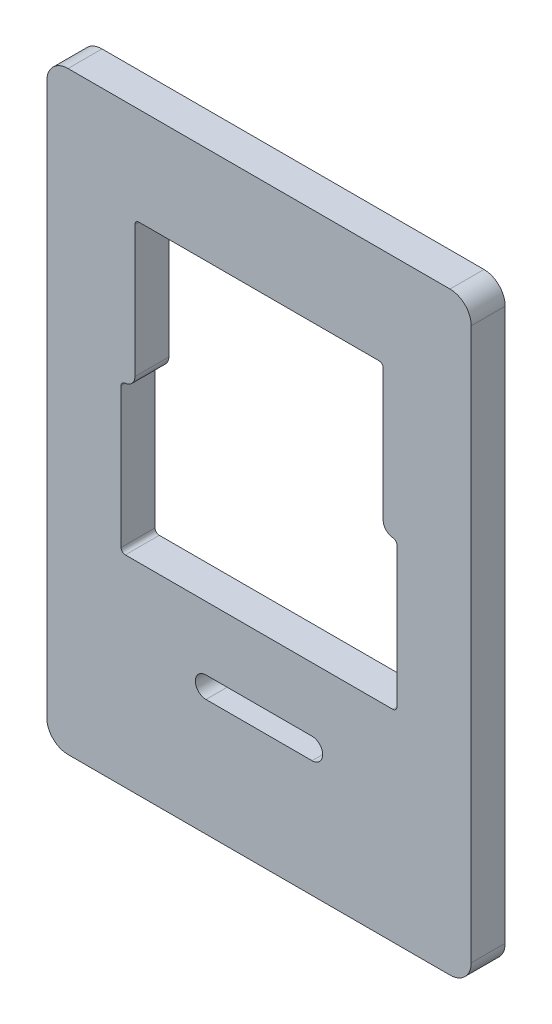
ISO-10303-21;
HEADER;
FILE_DESCRIPTION(('STEP AP214'),'2;1');
FILE_NAME('part.step','',(''),(''),'','','');
FILE_SCHEMA(('AUTOMOTIVE_DESIGN { 1 0 10303 214 1 1 1 1 }'));
ENDSEC;
DATA;
#1=APPLICATION_CONTEXT('core data for automotive mechanical design processes');
#2=APPLICATION_PROTOCOL_DEFINITION('international standard','automotive_design',2000,#1);
#3=PRODUCT_CONTEXT('',#1,'mechanical');
#4=PRODUCT('Part','Part','',(#3));
#5=PRODUCT_RELATED_PRODUCT_CATEGORY('part','',(#4));
#6=PRODUCT_DEFINITION_FORMATION('','',#4);
#7=PRODUCT_DEFINITION_CONTEXT('part definition',#1,'design');
#8=PRODUCT_DEFINITION('design','',#6,#7);
#9=PRODUCT_DEFINITION_SHAPE('','',#8);
#10=(LENGTH_UNIT() NAMED_UNIT(*) SI_UNIT(.MILLI.,.METRE.));
#11=(NAMED_UNIT(*) PLANE_ANGLE_UNIT() SI_UNIT($,.RADIAN.));
#12=(NAMED_UNIT(*) SI_UNIT($,.STERADIAN.) SOLID_ANGLE_UNIT());
#13=UNCERTAINTY_MEASURE_WITH_UNIT(LENGTH_MEASURE(1.E-05),#10,'distance_accuracy_value','');
#14=(GEOMETRIC_REPRESENTATION_CONTEXT(3) GLOBAL_UNCERTAINTY_ASSIGNED_CONTEXT((#13)) GLOBAL_UNIT_ASSIGNED_CONTEXT((#10,
#11,#12)) REPRESENTATION_CONTEXT('',''));
#15=CARTESIAN_POINT('',(0.,0.,0.));
#16=DIRECTION('',(0.,0.,1.));
#17=DIRECTION('',(1.,0.,0.));
#18=AXIS2_PLACEMENT_3D('',#15,#16,#17);
#19=CARTESIAN_POINT('',(10.,14.,-1.6));
#20=DIRECTION('',(1.,0.,0.));
#21=DIRECTION('',(0.,1.,0.));
#22=AXIS2_PLACEMENT_3D('',#19,#20,#21);
#23=PLANE('',#22);
#24=DIRECTION('',(0.,1.,0.));
#25=VECTOR('',#24,1.);
#26=CARTESIAN_POINT('',(10.,14.,0.));
#27=LINE('',#26,#25);
#28=CARTESIAN_POINT('',(10.,-13.,0.));
#29=VERTEX_POINT('',#28);
#30=CARTESIAN_POINT('',(10.,13.,0.));
#31=VERTEX_POINT('',#30);
#32=EDGE_CURVE('E248',#29,#31,#27,.T.);
#33=ORIENTED_EDGE('',*,*,#32,.F.);
#34=DIRECTION('',(0.,0.,1.));
#35=VECTOR('',#34,1.);
#36=CARTESIAN_POINT('',(10.,-13.,-1.6));
#37=LINE('',#36,#35);
#38=CARTESIAN_POINT('',(10.,-13.,-1.6));
#39=VERTEX_POINT('',#38);
#40=EDGE_CURVE('E373',#29,#39,#37,.F.);
#41=ORIENTED_EDGE('',*,*,#40,.T.);
#42=DIRECTION('',(0.,1.,0.));
#43=VECTOR('',#42,1.);
#44=CARTESIAN_POINT('',(10.,14.,-1.6));
#45=LINE('',#44,#43);
#46=CARTESIAN_POINT('',(10.,13.,-1.6));
#47=VERTEX_POINT('',#46);
#48=EDGE_CURVE('E252',#39,#47,#45,.T.);
#49=ORIENTED_EDGE('',*,*,#48,.T.);
#50=DIRECTION('',(0.,0.,1.));
#51=VECTOR('',#50,1.);
#52=CARTESIAN_POINT('',(10.,13.,-1.6));
#53=LINE('',#52,#51);
#54=EDGE_CURVE('E370',#47,#31,#53,.T.);
#55=ORIENTED_EDGE('',*,*,#54,.T.);
#56=EDGE_LOOP('',(#33,#41,#49,#55));
#57=FACE_BOUND('',#56,.T.);
#58=ADVANCED_FACE('F32',(#57),#23,.T.);
#59=CARTESIAN_POINT('',(-10.,-14.,-1.6));
#60=DIRECTION('',(0.,-1.,0.));
#61=DIRECTION('',(0.,0.,-1.));
#62=AXIS2_PLACEMENT_3D('',#59,#60,#61);
#63=PLANE('',#62);
#64=DIRECTION('',(1.,0.,0.));
#65=VECTOR('',#64,1.);
#66=CARTESIAN_POINT('',(-10.,-14.,0.));
#67=LINE('',#66,#65);
#68=CARTESIAN_POINT('',(-9.,-14.,0.));
#69=VERTEX_POINT('',#68);
#70=CARTESIAN_POINT('',(9.,-14.,0.));
#71=VERTEX_POINT('',#70);
#72=EDGE_CURVE('E256',#69,#71,#67,.T.);
#73=ORIENTED_EDGE('',*,*,#72,.F.);
#74=DIRECTION('',(0.,0.,1.));
#75=VECTOR('',#74,1.);
#76=CARTESIAN_POINT('',(-9.,-14.,-1.6));
#77=LINE('',#76,#75);
#78=CARTESIAN_POINT('',(-9.,-14.,-1.6));
#79=VERTEX_POINT('',#78);
#80=EDGE_CURVE('E361',#69,#79,#77,.F.);
#81=ORIENTED_EDGE('',*,*,#80,.T.);
#82=DIRECTION('',(1.,0.,0.));
#83=VECTOR('',#82,1.);
#84=CARTESIAN_POINT('',(-10.,-14.,-1.6));
#85=LINE('',#84,#83);
#86=CARTESIAN_POINT('',(9.,-14.,-1.6));
#87=VERTEX_POINT('',#86);
#88=EDGE_CURVE('E261',#79,#87,#85,.T.);
#89=ORIENTED_EDGE('',*,*,#88,.T.);
#90=DIRECTION('',(0.,0.,1.));
#91=VECTOR('',#90,1.);
#92=CARTESIAN_POINT('',(9.,-14.,-1.6));
#93=LINE('',#92,#91);
#94=EDGE_CURVE('E358',#87,#71,#93,.T.);
#95=ORIENTED_EDGE('',*,*,#94,.T.);
#96=EDGE_LOOP('',(#73,#81,#89,#95));
#97=FACE_BOUND('',#96,.T.);
#98=ADVANCED_FACE('F396',(#97),#63,.T.);
#99=CARTESIAN_POINT('',(-10.,14.,-1.6));
#100=DIRECTION('',(-1.,0.,0.));
#101=DIRECTION('',(0.,-1.,0.));
#102=AXIS2_PLACEMENT_3D('',#99,#100,#101);
#103=PLANE('',#102);
#104=DIRECTION('',(0.,-1.,0.));
#105=VECTOR('',#104,1.);
#106=CARTESIAN_POINT('',(-10.,14.,-1.6));
#107=LINE('',#106,#105);
#108=CARTESIAN_POINT('',(-10.,13.,-1.6));
#109=VERTEX_POINT('',#108);
#110=CARTESIAN_POINT('',(-10.,-13.,-1.6));
#111=VERTEX_POINT('',#110);
#112=EDGE_CURVE('E258',#109,#111,#107,.T.);
#113=ORIENTED_EDGE('',*,*,#112,.T.);
#114=DIRECTION('',(0.,0.,1.));
#115=VECTOR('',#114,1.);
#116=CARTESIAN_POINT('',(-10.,-13.,-1.6));
#117=LINE('',#116,#115);
#118=CARTESIAN_POINT('',(-10.,-13.,0.));
#119=VERTEX_POINT('',#118);
#120=EDGE_CURVE('E347',#111,#119,#117,.T.);
#121=ORIENTED_EDGE('',*,*,#120,.T.);
#122=DIRECTION('',(0.,-1.,0.));
#123=VECTOR('',#122,1.);
#124=CARTESIAN_POINT('',(-10.,14.,0.));
#125=LINE('',#124,#123);
#126=CARTESIAN_POINT('',(-10.,13.,0.));
#127=VERTEX_POINT('',#126);
#128=EDGE_CURVE('E270',#127,#119,#125,.T.);
#129=ORIENTED_EDGE('',*,*,#128,.F.);
#130=DIRECTION('',(0.,0.,1.));
#131=VECTOR('',#130,1.);
#132=CARTESIAN_POINT('',(-10.,13.,-1.6));
#133=LINE('',#132,#131);
#134=EDGE_CURVE('E345',#127,#109,#133,.F.);
#135=ORIENTED_EDGE('',*,*,#134,.T.);
#136=EDGE_LOOP('',(#113,#121,#129,#135));
#137=FACE_BOUND('',#136,.T.);
#138=ADVANCED_FACE('F403',(#137),#103,.T.);
#139=CARTESIAN_POINT('',(-10.,14.,-1.6));
#140=DIRECTION('',(0.,1.,0.));
#141=DIRECTION('',(0.,0.,1.));
#142=AXIS2_PLACEMENT_3D('',#139,#140,#141);
#143=PLANE('',#142);
#144=DIRECTION('',(-1.,0.,0.));
#145=VECTOR('',#144,1.);
#146=CARTESIAN_POINT('',(-10.,14.,0.));
#147=LINE('',#146,#145);
#148=CARTESIAN_POINT('',(9.,14.,0.));
#149=VERTEX_POINT('',#148);
#150=CARTESIAN_POINT('',(-9.,14.,0.));
#151=VERTEX_POINT('',#150);
#152=EDGE_CURVE('E267',#149,#151,#147,.T.);
#153=ORIENTED_EDGE('',*,*,#152,.F.);
#154=DIRECTION('',(0.,0.,1.));
#155=VECTOR('',#154,1.);
#156=CARTESIAN_POINT('',(9.,14.,-1.6));
#157=LINE('',#156,#155);
#158=CARTESIAN_POINT('',(9.,14.,-1.6));
#159=VERTEX_POINT('',#158);
#160=EDGE_CURVE('E11',#149,#159,#157,.F.);
#161=ORIENTED_EDGE('',*,*,#160,.T.);
#162=DIRECTION('',(-1.,0.,0.));
#163=VECTOR('',#162,1.);
#164=CARTESIAN_POINT('',(-10.,14.,-1.6));
#165=LINE('',#164,#163);
#166=CARTESIAN_POINT('',(-9.,14.,-1.6));
#167=VERTEX_POINT('',#166);
#168=EDGE_CURVE('E255',#159,#167,#165,.T.);
#169=ORIENTED_EDGE('',*,*,#168,.T.);
#170=DIRECTION('',(0.,0.,1.));
#171=VECTOR('',#170,1.);
#172=CARTESIAN_POINT('',(-9.,14.,-1.6));
#173=LINE('',#172,#171);
#174=EDGE_CURVE('E40',#167,#151,#173,.T.);
#175=ORIENTED_EDGE('',*,*,#174,.T.);
#176=EDGE_LOOP('',(#153,#161,#169,#175));
#177=FACE_BOUND('',#176,.T.);
#178=ADVANCED_FACE('F376',(#177),#143,.T.);
#179=CARTESIAN_POINT('',(0.,0.,-1.6));
#180=DIRECTION('',(0.,0.,1.));
#181=DIRECTION('',(1.,0.,0.));
#182=AXIS2_PLACEMENT_3D('',#179,#180,#181);
#183=PLANE('',#182);
#184=DIRECTION('',(0.,1.,0.));
#185=VECTOR('',#184,1.);
#186=CARTESIAN_POINT('',(6.5,2.5,-1.6));
#187=LINE('',#186,#185);
#188=CARTESIAN_POINT('',(6.5,-4.3,-1.6));
#189=VERTEX_POINT('',#188);
#190=CARTESIAN_POINT('',(6.5,2.30178799781155,-1.6));
#191=VERTEX_POINT('',#190);
#192=EDGE_CURVE('E663',#189,#191,#187,.T.);
#193=ORIENTED_EDGE('',*,*,#192,.T.);
#194=CARTESIAN_POINT('',(6.3,2.30178799781155,-1.6));
#195=DIRECTION('',(0.,0.,1.));
#196=DIRECTION('',(1.,0.,0.));
#197=AXIS2_PLACEMENT_3D('',#194,#195,#196);
#198=CIRCLE('',#197,0.2);
#199=CARTESIAN_POINT('',(6.31428571428571,2.50127714129396,-1.6));
#200=VERTEX_POINT('',#199);
#201=EDGE_CURVE('E331',#191,#200,#198,.T.);
#202=ORIENTED_EDGE('',*,*,#201,.T.);
#203=CARTESIAN_POINT('',(6.35,3.,-1.6));
#204=DIRECTION('',(0.,0.,1.));
#205=DIRECTION('',(1.,0.,0.));
#206=AXIS2_PLACEMENT_3D('',#203,#204,#205);
#207=CIRCLE('',#206,0.5);
#208=CARTESIAN_POINT('',(5.85,3.,-1.6));
#209=VERTEX_POINT('',#208);
#210=EDGE_CURVE('E286',#200,#209,#207,.F.);
#211=ORIENTED_EDGE('',*,*,#210,.T.);
#212=DIRECTION('',(0.,1.,0.));
#213=VECTOR('',#212,1.);
#214=CARTESIAN_POINT('',(5.85,9.4,-1.6));
#215=LINE('',#214,#213);
#216=CARTESIAN_POINT('',(5.85,9.2,-1.6));
#217=VERTEX_POINT('',#216);
#218=EDGE_CURVE('E691',#209,#217,#215,.T.);
#219=ORIENTED_EDGE('',*,*,#218,.T.);
#220=CARTESIAN_POINT('',(5.65,9.2,-1.6));
#221=DIRECTION('',(0.,0.,1.));
#222=DIRECTION('',(1.,0.,0.));
#223=AXIS2_PLACEMENT_3D('',#220,#221,#222);
#224=CIRCLE('',#223,0.2);
#225=CARTESIAN_POINT('',(5.65,9.4,-1.6));
#226=VERTEX_POINT('',#225);
#227=EDGE_CURVE('E343',#217,#226,#224,.T.);
#228=ORIENTED_EDGE('',*,*,#227,.T.);
#229=DIRECTION('',(-1.,0.,0.));
#230=VECTOR('',#229,1.);
#231=CARTESIAN_POINT('',(-5.85,9.4,-1.6));
#232=LINE('',#231,#230);
#233=CARTESIAN_POINT('',(-5.65,9.4,-1.6));
#234=VERTEX_POINT('',#233);
#235=EDGE_CURVE('E722',#226,#234,#232,.T.);
#236=ORIENTED_EDGE('',*,*,#235,.T.);
#237=CARTESIAN_POINT('',(-5.65,9.2,-1.6));
#238=DIRECTION('',(0.,0.,1.));
#239=DIRECTION('',(1.,0.,0.));
#240=AXIS2_PLACEMENT_3D('',#237,#238,#239);
#241=CIRCLE('',#240,0.2);
#242=CARTESIAN_POINT('',(-5.85,9.2,-1.6));
#243=VERTEX_POINT('',#242);
#244=EDGE_CURVE('E339',#234,#243,#241,.T.);
#245=ORIENTED_EDGE('',*,*,#244,.T.);
#246=DIRECTION('',(0.,-1.,0.));
#247=VECTOR('',#246,1.);
#248=CARTESIAN_POINT('',(-5.85,9.4,-1.6));
#249=LINE('',#248,#247);
#250=CARTESIAN_POINT('',(-5.85,3.,-1.6));
#251=VERTEX_POINT('',#250);
#252=EDGE_CURVE('E688',#243,#251,#249,.T.);
#253=ORIENTED_EDGE('',*,*,#252,.T.);
#254=CARTESIAN_POINT('',(-6.35,3.,-1.6));
#255=DIRECTION('',(0.,0.,1.));
#256=DIRECTION('',(1.,0.,0.));
#257=AXIS2_PLACEMENT_3D('',#254,#255,#256);
#258=CIRCLE('',#257,0.5);
#259=CARTESIAN_POINT('',(-6.31428571428571,2.50127714129396,-1.6));
#260=VERTEX_POINT('',#259);
#261=EDGE_CURVE('E283',#251,#260,#258,.F.);
#262=ORIENTED_EDGE('',*,*,#261,.T.);
#263=CARTESIAN_POINT('',(-6.3,2.30178799781155,-1.6));
#264=DIRECTION('',(0.,0.,1.));
#265=DIRECTION('',(1.,0.,0.));
#266=AXIS2_PLACEMENT_3D('',#263,#264,#265);
#267=CIRCLE('',#266,0.2);
#268=CARTESIAN_POINT('',(-6.5,2.30178799781155,-1.6));
#269=VERTEX_POINT('',#268);
#270=EDGE_CURVE('E335',#260,#269,#267,.T.);
#271=ORIENTED_EDGE('',*,*,#270,.T.);
#272=DIRECTION('',(0.,-1.,0.));
#273=VECTOR('',#272,1.);
#274=CARTESIAN_POINT('',(-6.5,2.5,-1.6));
#275=LINE('',#274,#273);
#276=CARTESIAN_POINT('',(-6.5,-4.3,-1.6));
#277=VERTEX_POINT('',#276);
#278=EDGE_CURVE('E669',#269,#277,#275,.T.);
#279=ORIENTED_EDGE('',*,*,#278,.T.);
#280=CARTESIAN_POINT('',(-6.3,-4.3,-1.6));
#281=DIRECTION('',(0.,0.,1.));
#282=DIRECTION('',(1.,0.,0.));
#283=AXIS2_PLACEMENT_3D('',#280,#281,#282);
#284=CIRCLE('',#283,0.2);
#285=CARTESIAN_POINT('',(-6.3,-4.5,-1.6));
#286=VERTEX_POINT('',#285);
#287=EDGE_CURVE('E323',#277,#286,#284,.T.);
#288=ORIENTED_EDGE('',*,*,#287,.T.);
#289=DIRECTION('',(1.,0.,0.));
#290=VECTOR('',#289,1.);
#291=CARTESIAN_POINT('',(-6.5,-4.5,-1.6));
#292=LINE('',#291,#290);
#293=CARTESIAN_POINT('',(6.3,-4.5,-1.6));
#294=VERTEX_POINT('',#293);
#295=EDGE_CURVE('E242',#286,#294,#292,.T.);
#296=ORIENTED_EDGE('',*,*,#295,.T.);
#297=CARTESIAN_POINT('',(6.3,-4.3,-1.6));
#298=DIRECTION('',(0.,0.,1.));
#299=DIRECTION('',(1.,0.,0.));
#300=AXIS2_PLACEMENT_3D('',#297,#298,#299);
#301=CIRCLE('',#300,0.2);
#302=EDGE_CURVE('E327',#294,#189,#301,.T.);
#303=ORIENTED_EDGE('',*,*,#302,.T.);
#304=EDGE_LOOP('',(#193,#202,#211,#219,#228,#236,#245,#253,#262,#271,#279,#288,#296,#303));
#305=FACE_BOUND('',#304,.T.);
#306=DIRECTION('',(-1.,0.,0.));
#307=VECTOR('',#306,1.);
#308=CARTESIAN_POINT('',(-2.5,-7.5,-1.6));
#309=LINE('',#308,#307);
#310=CARTESIAN_POINT('',(2.5,-7.5,-1.6));
#311=VERTEX_POINT('',#310);
#312=CARTESIAN_POINT('',(-2.5,-7.5,-1.6));
#313=VERTEX_POINT('',#312);
#314=EDGE_CURVE('E217',#311,#313,#309,.T.);
#315=ORIENTED_EDGE('',*,*,#314,.T.);
#316=CARTESIAN_POINT('',(-2.5,-8.,-1.6));
#317=DIRECTION('',(0.,0.,1.));
#318=DIRECTION('',(1.,0.,0.));
#319=AXIS2_PLACEMENT_3D('',#316,#317,#318);
#320=CIRCLE('',#319,0.5);
#321=CARTESIAN_POINT('',(-2.5,-8.5,-1.6));
#322=VERTEX_POINT('',#321);
#323=EDGE_CURVE('E209',#313,#322,#320,.T.);
#324=ORIENTED_EDGE('',*,*,#323,.T.);
#325=DIRECTION('',(1.,0.,0.));
#326=VECTOR('',#325,1.);
#327=CARTESIAN_POINT('',(-2.5,-8.5,-1.6));
#328=LINE('',#327,#326);
#329=CARTESIAN_POINT('',(2.5,-8.5,-1.6));
#330=VERTEX_POINT('',#329);
#331=EDGE_CURVE('E221',#322,#330,#328,.T.);
#332=ORIENTED_EDGE('',*,*,#331,.T.);
#333=CARTESIAN_POINT('',(2.5,-8.,-1.6));
#334=DIRECTION('',(0.,0.,1.));
#335=DIRECTION('',(1.,0.,0.));
#336=AXIS2_PLACEMENT_3D('',#333,#334,#335);
#337=CIRCLE('',#336,0.5);
#338=EDGE_CURVE('E225',#330,#311,#337,.T.);
#339=ORIENTED_EDGE('',*,*,#338,.T.);
#340=EDGE_LOOP('',(#315,#324,#332,#339));
#341=FACE_BOUND('',#340,.T.);
#342=ORIENTED_EDGE('',*,*,#88,.F.);
#343=CARTESIAN_POINT('',(-9.,-13.,-1.6));
#344=DIRECTION('',(0.,0.,1.));
#345=DIRECTION('',(1.,0.,0.));
#346=AXIS2_PLACEMENT_3D('',#343,#344,#345);
#347=CIRCLE('',#346,1.);
#348=EDGE_CURVE('E368',#79,#111,#347,.F.);
#349=ORIENTED_EDGE('',*,*,#348,.T.);
#350=ORIENTED_EDGE('',*,*,#112,.F.);
#351=CARTESIAN_POINT('',(-9.,13.,-1.6));
#352=DIRECTION('',(0.,0.,1.));
#353=DIRECTION('',(1.,0.,0.));
#354=AXIS2_PLACEMENT_3D('',#351,#352,#353);
#355=CIRCLE('',#354,1.);
#356=EDGE_CURVE('E47',#109,#167,#355,.F.);
#357=ORIENTED_EDGE('',*,*,#356,.T.);
#358=ORIENTED_EDGE('',*,*,#168,.F.);
#359=CARTESIAN_POINT('',(9.,13.,-1.6));
#360=DIRECTION('',(0.,0.,1.));
#361=DIRECTION('',(1.,0.,0.));
#362=AXIS2_PLACEMENT_3D('',#359,#360,#361);
#363=CIRCLE('',#362,1.);
#364=EDGE_CURVE('E364',#159,#47,#363,.F.);
#365=ORIENTED_EDGE('',*,*,#364,.T.);
#366=ORIENTED_EDGE('',*,*,#48,.F.);
#367=CARTESIAN_POINT('',(9.,-13.,-1.6));
#368=DIRECTION('',(0.,0.,1.));
#369=DIRECTION('',(1.,0.,0.));
#370=AXIS2_PLACEMENT_3D('',#367,#368,#369);
#371=CIRCLE('',#370,1.);
#372=EDGE_CURVE('E366',#39,#87,#371,.F.);
#373=ORIENTED_EDGE('',*,*,#372,.T.);
#374=EDGE_LOOP('',(#342,#349,#350,#357,#358,#365,#366,#373));
#375=FACE_BOUND('',#374,.T.);
#376=ADVANCED_FACE('F227',(#305,#341,#375),#183,.F.);
#377=CARTESIAN_POINT('',(0.,0.,0.));
#378=DIRECTION('',(0.,0.,1.));
#379=DIRECTION('',(1.,0.,0.));
#380=AXIS2_PLACEMENT_3D('',#377,#378,#379);
#381=PLANE('',#380);
#382=DIRECTION('',(0.,1.,0.));
#383=VECTOR('',#382,1.);
#384=CARTESIAN_POINT('',(5.85,9.4,0.));
#385=LINE('',#384,#383);
#386=CARTESIAN_POINT('',(5.85,3.,0.));
#387=VERTEX_POINT('',#386);
#388=CARTESIAN_POINT('',(5.85,9.2,0.));
#389=VERTEX_POINT('',#388);
#390=EDGE_CURVE('E679',#387,#389,#385,.T.);
#391=ORIENTED_EDGE('',*,*,#390,.F.);
#392=CARTESIAN_POINT('',(6.35,3.,0.));
#393=DIRECTION('',(0.,0.,1.));
#394=DIRECTION('',(1.,0.,0.));
#395=AXIS2_PLACEMENT_3D('',#392,#393,#394);
#396=CIRCLE('',#395,0.5);
#397=CARTESIAN_POINT('',(6.31428571428571,2.50127714129396,0.));
#398=VERTEX_POINT('',#397);
#399=EDGE_CURVE('E280',#387,#398,#396,.T.);
#400=ORIENTED_EDGE('',*,*,#399,.T.);
#401=CARTESIAN_POINT('',(6.3,2.30178799781155,0.));
#402=DIRECTION('',(0.,0.,1.));
#403=DIRECTION('',(1.,0.,0.));
#404=AXIS2_PLACEMENT_3D('',#401,#402,#403);
#405=CIRCLE('',#404,0.2);
#406=CARTESIAN_POINT('',(6.5,2.30178799781155,0.));
#407=VERTEX_POINT('',#406);
#408=EDGE_CURVE('E329',#398,#407,#405,.F.);
#409=ORIENTED_EDGE('',*,*,#408,.T.);
#410=DIRECTION('',(0.,1.,0.));
#411=VECTOR('',#410,1.);
#412=CARTESIAN_POINT('',(6.5,2.5,0.));
#413=LINE('',#412,#411);
#414=CARTESIAN_POINT('',(6.5,-4.3,0.));
#415=VERTEX_POINT('',#414);
#416=EDGE_CURVE('E696',#415,#407,#413,.T.);
#417=ORIENTED_EDGE('',*,*,#416,.F.);
#418=CARTESIAN_POINT('',(6.3,-4.3,0.));
#419=DIRECTION('',(0.,0.,1.));
#420=DIRECTION('',(1.,0.,0.));
#421=AXIS2_PLACEMENT_3D('',#418,#419,#420);
#422=CIRCLE('',#421,0.2);
#423=CARTESIAN_POINT('',(6.3,-4.5,0.));
#424=VERTEX_POINT('',#423);
#425=EDGE_CURVE('E325',#415,#424,#422,.F.);
#426=ORIENTED_EDGE('',*,*,#425,.T.);
#427=DIRECTION('',(1.,0.,0.));
#428=VECTOR('',#427,1.);
#429=CARTESIAN_POINT('',(-6.5,-4.5,0.));
#430=LINE('',#429,#428);
#431=CARTESIAN_POINT('',(-6.3,-4.5,0.));
#432=VERTEX_POINT('',#431);
#433=EDGE_CURVE('E235',#432,#424,#430,.T.);
#434=ORIENTED_EDGE('',*,*,#433,.F.);
#435=CARTESIAN_POINT('',(-6.3,-4.3,0.));
#436=DIRECTION('',(0.,0.,1.));
#437=DIRECTION('',(1.,0.,0.));
#438=AXIS2_PLACEMENT_3D('',#435,#436,#437);
#439=CIRCLE('',#438,0.2);
#440=CARTESIAN_POINT('',(-6.5,-4.3,0.));
#441=VERTEX_POINT('',#440);
#442=EDGE_CURVE('E321',#432,#441,#439,.F.);
#443=ORIENTED_EDGE('',*,*,#442,.T.);
#444=DIRECTION('',(0.,-1.,0.));
#445=VECTOR('',#444,1.);
#446=CARTESIAN_POINT('',(-6.5,2.5,0.));
#447=LINE('',#446,#445);
#448=CARTESIAN_POINT('',(-6.5,2.30178799781155,0.));
#449=VERTEX_POINT('',#448);
#450=EDGE_CURVE('E697',#449,#441,#447,.T.);
#451=ORIENTED_EDGE('',*,*,#450,.F.);
#452=CARTESIAN_POINT('',(-6.3,2.30178799781155,0.));
#453=DIRECTION('',(0.,0.,1.));
#454=DIRECTION('',(1.,0.,0.));
#455=AXIS2_PLACEMENT_3D('',#452,#453,#454);
#456=CIRCLE('',#455,0.2);
#457=CARTESIAN_POINT('',(-6.31428571428571,2.50127714129396,0.));
#458=VERTEX_POINT('',#457);
#459=EDGE_CURVE('E333',#449,#458,#456,.F.);
#460=ORIENTED_EDGE('',*,*,#459,.T.);
#461=CARTESIAN_POINT('',(-6.35,3.,0.));
#462=DIRECTION('',(0.,0.,1.));
#463=DIRECTION('',(1.,0.,0.));
#464=AXIS2_PLACEMENT_3D('',#461,#462,#463);
#465=CIRCLE('',#464,0.5);
#466=CARTESIAN_POINT('',(-5.85,3.,0.));
#467=VERTEX_POINT('',#466);
#468=EDGE_CURVE('E277',#458,#467,#465,.T.);
#469=ORIENTED_EDGE('',*,*,#468,.T.);
#470=DIRECTION('',(0.,-1.,0.));
#471=VECTOR('',#470,1.);
#472=CARTESIAN_POINT('',(-5.85,9.4,0.));
#473=LINE('',#472,#471);
#474=CARTESIAN_POINT('',(-5.85,9.2,0.));
#475=VERTEX_POINT('',#474);
#476=EDGE_CURVE('E685',#475,#467,#473,.T.);
#477=ORIENTED_EDGE('',*,*,#476,.F.);
#478=CARTESIAN_POINT('',(-5.65,9.2,0.));
#479=DIRECTION('',(0.,0.,1.));
#480=DIRECTION('',(1.,0.,0.));
#481=AXIS2_PLACEMENT_3D('',#478,#479,#480);
#482=CIRCLE('',#481,0.2);
#483=CARTESIAN_POINT('',(-5.65,9.4,0.));
#484=VERTEX_POINT('',#483);
#485=EDGE_CURVE('E337',#475,#484,#482,.F.);
#486=ORIENTED_EDGE('',*,*,#485,.T.);
#487=DIRECTION('',(-1.,0.,0.));
#488=VECTOR('',#487,1.);
#489=CARTESIAN_POINT('',(-5.85,9.4,0.));
#490=LINE('',#489,#488);
#491=CARTESIAN_POINT('',(5.65,9.4,0.));
#492=VERTEX_POINT('',#491);
#493=EDGE_CURVE('E682',#492,#484,#490,.T.);
#494=ORIENTED_EDGE('',*,*,#493,.F.);
#495=CARTESIAN_POINT('',(5.65,9.2,0.));
#496=DIRECTION('',(0.,0.,1.));
#497=DIRECTION('',(1.,0.,0.));
#498=AXIS2_PLACEMENT_3D('',#495,#496,#497);
#499=CIRCLE('',#498,0.2);
#500=EDGE_CURVE('E341',#492,#389,#499,.F.);
#501=ORIENTED_EDGE('',*,*,#500,.T.);
#502=EDGE_LOOP('',(#391,#400,#409,#417,#426,#434,#443,#451,#460,#469,#477,#486,#494,#501));
#503=FACE_BOUND('',#502,.T.);
#504=CARTESIAN_POINT('',(-2.5,-8.,0.));
#505=DIRECTION('',(0.,0.,1.));
#506=DIRECTION('',(1.,0.,0.));
#507=AXIS2_PLACEMENT_3D('',#504,#505,#506);
#508=CIRCLE('',#507,0.5);
#509=CARTESIAN_POINT('',(-2.5,-7.5,0.));
#510=VERTEX_POINT('',#509);
#511=CARTESIAN_POINT('',(-2.5,-8.5,0.));
#512=VERTEX_POINT('',#511);
#513=EDGE_CURVE('E212',#510,#512,#508,.T.);
#514=ORIENTED_EDGE('',*,*,#513,.F.);
#515=DIRECTION('',(-1.,0.,0.));
#516=VECTOR('',#515,1.);
#517=CARTESIAN_POINT('',(-2.5,-7.5,0.));
#518=LINE('',#517,#516);
#519=CARTESIAN_POINT('',(2.5,-7.5,0.));
#520=VERTEX_POINT('',#519);
#521=EDGE_CURVE('E229',#520,#510,#518,.T.);
#522=ORIENTED_EDGE('',*,*,#521,.F.);
#523=CARTESIAN_POINT('',(2.5,-8.,0.));
#524=DIRECTION('',(0.,0.,1.));
#525=DIRECTION('',(1.,0.,0.));
#526=AXIS2_PLACEMENT_3D('',#523,#524,#525);
#527=CIRCLE('',#526,0.5);
#528=CARTESIAN_POINT('',(2.5,-8.5,0.));
#529=VERTEX_POINT('',#528);
#530=EDGE_CURVE('E232',#529,#520,#527,.T.);
#531=ORIENTED_EDGE('',*,*,#530,.F.);
#532=DIRECTION('',(1.,0.,0.));
#533=VECTOR('',#532,1.);
#534=CARTESIAN_POINT('',(-2.5,-8.5,0.));
#535=LINE('',#534,#533);
#536=EDGE_CURVE('E241',#512,#529,#535,.T.);
#537=ORIENTED_EDGE('',*,*,#536,.F.);
#538=EDGE_LOOP('',(#514,#522,#531,#537));
#539=FACE_BOUND('',#538,.T.);
#540=ORIENTED_EDGE('',*,*,#128,.T.);
#541=CARTESIAN_POINT('',(-9.,-13.,0.));
#542=DIRECTION('',(0.,0.,1.));
#543=DIRECTION('',(1.,0.,0.));
#544=AXIS2_PLACEMENT_3D('',#541,#542,#543);
#545=CIRCLE('',#544,1.);
#546=EDGE_CURVE('E356',#119,#69,#545,.T.);
#547=ORIENTED_EDGE('',*,*,#546,.T.);
#548=ORIENTED_EDGE('',*,*,#72,.T.);
#549=CARTESIAN_POINT('',(9.,-13.,0.));
#550=DIRECTION('',(0.,0.,1.));
#551=DIRECTION('',(1.,0.,0.));
#552=AXIS2_PLACEMENT_3D('',#549,#550,#551);
#553=CIRCLE('',#552,1.);
#554=EDGE_CURVE('E354',#71,#29,#553,.T.);
#555=ORIENTED_EDGE('',*,*,#554,.T.);
#556=ORIENTED_EDGE('',*,*,#32,.T.);
#557=CARTESIAN_POINT('',(9.,13.,0.));
#558=DIRECTION('',(0.,0.,1.));
#559=DIRECTION('',(1.,0.,0.));
#560=AXIS2_PLACEMENT_3D('',#557,#558,#559);
#561=CIRCLE('',#560,1.);
#562=EDGE_CURVE('E352',#31,#149,#561,.T.);
#563=ORIENTED_EDGE('',*,*,#562,.T.);
#564=ORIENTED_EDGE('',*,*,#152,.T.);
#565=CARTESIAN_POINT('',(-9.,13.,0.));
#566=DIRECTION('',(0.,0.,1.));
#567=DIRECTION('',(1.,0.,0.));
#568=AXIS2_PLACEMENT_3D('',#565,#566,#567);
#569=CIRCLE('',#568,1.);
#570=EDGE_CURVE('E350',#151,#127,#569,.T.);
#571=ORIENTED_EDGE('',*,*,#570,.T.);
#572=EDGE_LOOP('',(#540,#547,#548,#555,#556,#563,#564,#571));
#573=FACE_BOUND('',#572,.T.);
#574=ADVANCED_FACE('F379',(#503,#539,#573),#381,.T.);
#575=CARTESIAN_POINT('',(-2.5,-8.,-1.6));
#576=DIRECTION('',(0.,0.,1.));
#577=DIRECTION('',(1.,0.,0.));
#578=AXIS2_PLACEMENT_3D('',#575,#576,#577);
#579=CYLINDRICAL_SURFACE('',#578,0.5);
#580=ORIENTED_EDGE('',*,*,#513,.T.);
#581=DIRECTION('',(0.,0.,1.));
#582=VECTOR('',#581,1.);
#583=CARTESIAN_POINT('',(-2.5,-8.5,-1.6));
#584=LINE('',#583,#582);
#585=EDGE_CURVE('E205',#322,#512,#584,.T.);
#586=ORIENTED_EDGE('',*,*,#585,.F.);
#587=ORIENTED_EDGE('',*,*,#323,.F.);
#588=DIRECTION('',(0.,0.,1.));
#589=VECTOR('',#588,1.);
#590=CARTESIAN_POINT('',(-2.5,-7.5,-1.6));
#591=LINE('',#590,#589);
#592=EDGE_CURVE('E246',#313,#510,#591,.T.);
#593=ORIENTED_EDGE('',*,*,#592,.T.);
#594=EDGE_LOOP('',(#580,#586,#587,#593));
#595=FACE_BOUND('',#594,.T.);
#596=ADVANCED_FACE('F207',(#595),#579,.F.);
#597=CARTESIAN_POINT('',(-2.5,-7.5,-1.6));
#598=DIRECTION('',(0.,1.,0.));
#599=DIRECTION('',(-1.,0.,0.));
#600=AXIS2_PLACEMENT_3D('',#597,#598,#599);
#601=PLANE('',#600);
#602=ORIENTED_EDGE('',*,*,#521,.T.);
#603=ORIENTED_EDGE('',*,*,#592,.F.);
#604=ORIENTED_EDGE('',*,*,#314,.F.);
#605=DIRECTION('',(0.,0.,1.));
#606=VECTOR('',#605,1.);
#607=CARTESIAN_POINT('',(2.5,-7.5,-1.6));
#608=LINE('',#607,#606);
#609=EDGE_CURVE('E249',#311,#520,#608,.T.);
#610=ORIENTED_EDGE('',*,*,#609,.T.);
#611=EDGE_LOOP('',(#602,#603,#604,#610));
#612=FACE_BOUND('',#611,.T.);
#613=ADVANCED_FACE('F584',(#612),#601,.F.);
#614=CARTESIAN_POINT('',(2.5,-8.,-1.6));
#615=DIRECTION('',(0.,0.,1.));
#616=DIRECTION('',(1.,0.,0.));
#617=AXIS2_PLACEMENT_3D('',#614,#615,#616);
#618=CYLINDRICAL_SURFACE('',#617,0.5);
#619=ORIENTED_EDGE('',*,*,#530,.T.);
#620=ORIENTED_EDGE('',*,*,#609,.F.);
#621=ORIENTED_EDGE('',*,*,#338,.F.);
#622=DIRECTION('',(0.,0.,1.));
#623=VECTOR('',#622,1.);
#624=CARTESIAN_POINT('',(2.5,-8.5,-1.6));
#625=LINE('',#624,#623);
#626=EDGE_CURVE('E216',#330,#529,#625,.T.);
#627=ORIENTED_EDGE('',*,*,#626,.T.);
#628=EDGE_LOOP('',(#619,#620,#621,#627));
#629=FACE_BOUND('',#628,.T.);
#630=ADVANCED_FACE('F576',(#629),#618,.F.);
#631=CARTESIAN_POINT('',(-2.5,-8.5,-1.6));
#632=DIRECTION('',(0.,-1.,0.));
#633=DIRECTION('',(1.,0.,0.));
#634=AXIS2_PLACEMENT_3D('',#631,#632,#633);
#635=PLANE('',#634);
#636=ORIENTED_EDGE('',*,*,#536,.T.);
#637=ORIENTED_EDGE('',*,*,#626,.F.);
#638=ORIENTED_EDGE('',*,*,#331,.F.);
#639=ORIENTED_EDGE('',*,*,#585,.T.);
#640=EDGE_LOOP('',(#636,#637,#638,#639));
#641=FACE_BOUND('',#640,.T.);
#642=ADVANCED_FACE('F222',(#641),#635,.F.);
#643=CARTESIAN_POINT('',(6.5,2.5,-1.6));
#644=DIRECTION('',(1.,0.,0.));
#645=DIRECTION('',(0.,0.,-1.));
#646=AXIS2_PLACEMENT_3D('',#643,#644,#645);
#647=PLANE('',#646);
#648=ORIENTED_EDGE('',*,*,#192,.F.);
#649=DIRECTION('',(0.,0.,1.));
#650=VECTOR('',#649,1.);
#651=CARTESIAN_POINT('',(6.5,-4.3,0.));
#652=LINE('',#651,#650);
#653=EDGE_CURVE('E303',#189,#415,#652,.T.);
#654=ORIENTED_EDGE('',*,*,#653,.T.);
#655=ORIENTED_EDGE('',*,*,#416,.T.);
#656=DIRECTION('',(0.,0.,1.));
#657=VECTOR('',#656,1.);
#658=CARTESIAN_POINT('',(6.5,2.30178799781155,-1.6));
#659=LINE('',#658,#657);
#660=EDGE_CURVE('E301',#407,#191,#659,.F.);
#661=ORIENTED_EDGE('',*,*,#660,.T.);
#662=EDGE_LOOP('',(#648,#654,#655,#661));
#663=FACE_BOUND('',#662,.T.);
#664=ADVANCED_FACE('F559',(#663),#647,.F.);
#665=CARTESIAN_POINT('',(-6.5,-4.5,-1.6));
#666=DIRECTION('',(0.,-1.,0.));
#667=DIRECTION('',(0.,0.,-1.));
#668=AXIS2_PLACEMENT_3D('',#665,#666,#667);
#669=PLANE('',#668);
#670=ORIENTED_EDGE('',*,*,#295,.F.);
#671=DIRECTION('',(0.,0.,1.));
#672=VECTOR('',#671,1.);
#673=CARTESIAN_POINT('',(-6.3,-4.5,0.));
#674=LINE('',#673,#672);
#675=EDGE_CURVE('E293',#286,#432,#674,.T.);
#676=ORIENTED_EDGE('',*,*,#675,.T.);
#677=ORIENTED_EDGE('',*,*,#433,.T.);
#678=DIRECTION('',(0.,0.,1.));
#679=VECTOR('',#678,1.);
#680=CARTESIAN_POINT('',(6.3,-4.5,-1.6));
#681=LINE('',#680,#679);
#682=EDGE_CURVE('E291',#424,#294,#681,.F.);
#683=ORIENTED_EDGE('',*,*,#682,.T.);
#684=EDGE_LOOP('',(#670,#676,#677,#683));
#685=FACE_BOUND('',#684,.T.);
#686=ADVANCED_FACE('F550',(#685),#669,.F.);
#687=CARTESIAN_POINT('',(-6.5,2.5,-1.6));
#688=DIRECTION('',(-1.,0.,0.));
#689=DIRECTION('',(0.,-1.,0.));
#690=AXIS2_PLACEMENT_3D('',#687,#688,#689);
#691=PLANE('',#690);
#692=ORIENTED_EDGE('',*,*,#450,.T.);
#693=DIRECTION('',(0.,0.,1.));
#694=VECTOR('',#693,1.);
#695=CARTESIAN_POINT('',(-6.5,-4.3,-1.6));
#696=LINE('',#695,#694);
#697=EDGE_CURVE('E299',#441,#277,#696,.F.);
#698=ORIENTED_EDGE('',*,*,#697,.T.);
#699=ORIENTED_EDGE('',*,*,#278,.F.);
#700=DIRECTION('',(0.,0.,1.));
#701=VECTOR('',#700,1.);
#702=CARTESIAN_POINT('',(-6.5,2.30178799781155,-1.6));
#703=LINE('',#702,#701);
#704=EDGE_CURVE('E296',#269,#449,#703,.T.);
#705=ORIENTED_EDGE('',*,*,#704,.T.);
#706=EDGE_LOOP('',(#692,#698,#699,#705));
#707=FACE_BOUND('',#706,.T.);
#708=ADVANCED_FACE('F541',(#707),#691,.F.);
#709=CARTESIAN_POINT('',(5.85,9.4,-1.6));
#710=DIRECTION('',(1.,0.,0.));
#711=DIRECTION('',(0.,1.,0.));
#712=AXIS2_PLACEMENT_3D('',#709,#710,#711);
#713=PLANE('',#712);
#714=ORIENTED_EDGE('',*,*,#390,.T.);
#715=DIRECTION('',(0.,0.,1.));
#716=VECTOR('',#715,1.);
#717=CARTESIAN_POINT('',(5.85,9.2,-1.6));
#718=LINE('',#717,#716);
#719=EDGE_CURVE('E319',#389,#217,#718,.F.);
#720=ORIENTED_EDGE('',*,*,#719,.T.);
#721=ORIENTED_EDGE('',*,*,#218,.F.);
#722=DIRECTION('',(0.,0.,1.));
#723=VECTOR('',#722,1.);
#724=CARTESIAN_POINT('',(5.85,3.,-1.6));
#725=LINE('',#724,#723);
#726=EDGE_CURVE('E264',#209,#387,#725,.T.);
#727=ORIENTED_EDGE('',*,*,#726,.T.);
#728=EDGE_LOOP('',(#714,#720,#721,#727));
#729=FACE_BOUND('',#728,.T.);
#730=ADVANCED_FACE('F532',(#729),#713,.F.);
#731=CARTESIAN_POINT('',(-5.85,9.4,-1.6));
#732=DIRECTION('',(-1.,0.,0.));
#733=DIRECTION('',(0.,0.,1.));
#734=AXIS2_PLACEMENT_3D('',#731,#732,#733);
#735=PLANE('',#734);
#736=ORIENTED_EDGE('',*,*,#252,.F.);
#737=DIRECTION('',(0.,0.,1.));
#738=VECTOR('',#737,1.);
#739=CARTESIAN_POINT('',(-5.85,9.2,0.));
#740=LINE('',#739,#738);
#741=EDGE_CURVE('E311',#243,#475,#740,.T.);
#742=ORIENTED_EDGE('',*,*,#741,.T.);
#743=ORIENTED_EDGE('',*,*,#476,.T.);
#744=DIRECTION('',(0.,0.,1.));
#745=VECTOR('',#744,1.);
#746=CARTESIAN_POINT('',(-5.85,3.,-1.6));
#747=LINE('',#746,#745);
#748=EDGE_CURVE('E288',#467,#251,#747,.F.);
#749=ORIENTED_EDGE('',*,*,#748,.T.);
#750=EDGE_LOOP('',(#736,#742,#743,#749));
#751=FACE_BOUND('',#750,.T.);
#752=ADVANCED_FACE('F523',(#751),#735,.F.);
#753=CARTESIAN_POINT('',(-5.85,9.4,-1.6));
#754=DIRECTION('',(0.,1.,0.));
#755=DIRECTION('',(0.,0.,1.));
#756=AXIS2_PLACEMENT_3D('',#753,#754,#755);
#757=PLANE('',#756);
#758=ORIENTED_EDGE('',*,*,#493,.T.);
#759=DIRECTION('',(0.,0.,1.));
#760=VECTOR('',#759,1.);
#761=CARTESIAN_POINT('',(-5.65,9.4,-1.6));
#762=LINE('',#761,#760);
#763=EDGE_CURVE('E317',#484,#234,#762,.F.);
#764=ORIENTED_EDGE('',*,*,#763,.T.);
#765=ORIENTED_EDGE('',*,*,#235,.F.);
#766=DIRECTION('',(0.,0.,1.));
#767=VECTOR('',#766,1.);
#768=CARTESIAN_POINT('',(5.65,9.4,0.));
#769=LINE('',#768,#767);
#770=EDGE_CURVE('E314',#226,#492,#769,.T.);
#771=ORIENTED_EDGE('',*,*,#770,.T.);
#772=EDGE_LOOP('',(#758,#764,#765,#771));
#773=FACE_BOUND('',#772,.T.);
#774=ADVANCED_FACE('F422',(#773),#757,.F.);
#775=CARTESIAN_POINT('',(6.35,3.,-1.6));
#776=DIRECTION('',(0.,0.,1.));
#777=DIRECTION('',(1.,0.,0.));
#778=AXIS2_PLACEMENT_3D('',#775,#776,#777);
#779=CYLINDRICAL_SURFACE('',#778,0.5);
#780=ORIENTED_EDGE('',*,*,#210,.F.);
#781=DIRECTION('',(0.,0.,1.));
#782=VECTOR('',#781,1.);
#783=CARTESIAN_POINT('',(6.31428571428571,2.50127714129396,-1.6));
#784=LINE('',#783,#782);
#785=EDGE_CURVE('E306',#200,#398,#784,.T.);
#786=ORIENTED_EDGE('',*,*,#785,.T.);
#787=ORIENTED_EDGE('',*,*,#399,.F.);
#788=ORIENTED_EDGE('',*,*,#726,.F.);
#789=EDGE_LOOP('',(#780,#786,#787,#788));
#790=FACE_BOUND('',#789,.T.);
#791=ADVANCED_FACE('F418',(#790),#779,.T.);
#792=CARTESIAN_POINT('',(-6.35,3.,-1.6));
#793=DIRECTION('',(0.,0.,1.));
#794=DIRECTION('',(1.,0.,0.));
#795=AXIS2_PLACEMENT_3D('',#792,#793,#794);
#796=CYLINDRICAL_SURFACE('',#795,0.5);
#797=ORIENTED_EDGE('',*,*,#468,.F.);
#798=DIRECTION('',(0.,0.,1.));
#799=VECTOR('',#798,1.);
#800=CARTESIAN_POINT('',(-6.31428571428571,2.50127714129396,-1.6));
#801=LINE('',#800,#799);
#802=EDGE_CURVE('E309',#458,#260,#801,.F.);
#803=ORIENTED_EDGE('',*,*,#802,.T.);
#804=ORIENTED_EDGE('',*,*,#261,.F.);
#805=ORIENTED_EDGE('',*,*,#748,.F.);
#806=EDGE_LOOP('',(#797,#803,#804,#805));
#807=FACE_BOUND('',#806,.T.);
#808=ADVANCED_FACE('F421',(#807),#796,.T.);
#809=CARTESIAN_POINT('',(-6.3,-4.3,-1.6));
#810=DIRECTION('',(0.,0.,-1.));
#811=DIRECTION('',(-1.,0.,0.));
#812=AXIS2_PLACEMENT_3D('',#809,#810,#811);
#813=CYLINDRICAL_SURFACE('',#812,0.2);
#814=ORIENTED_EDGE('',*,*,#287,.F.);
#815=ORIENTED_EDGE('',*,*,#697,.F.);
#816=ORIENTED_EDGE('',*,*,#442,.F.);
#817=ORIENTED_EDGE('',*,*,#675,.F.);
#818=EDGE_LOOP('',(#814,#815,#816,#817));
#819=FACE_BOUND('',#818,.T.);
#820=ADVANCED_FACE('F426',(#819),#813,.F.);
#821=CARTESIAN_POINT('',(6.3,-4.3,-1.6));
#822=DIRECTION('',(0.,0.,-1.));
#823=DIRECTION('',(-1.,0.,0.));
#824=AXIS2_PLACEMENT_3D('',#821,#822,#823);
#825=CYLINDRICAL_SURFACE('',#824,0.2);
#826=ORIENTED_EDGE('',*,*,#302,.F.);
#827=ORIENTED_EDGE('',*,*,#682,.F.);
#828=ORIENTED_EDGE('',*,*,#425,.F.);
#829=ORIENTED_EDGE('',*,*,#653,.F.);
#830=EDGE_LOOP('',(#826,#827,#828,#829));
#831=FACE_BOUND('',#830,.T.);
#832=ADVANCED_FACE('F430',(#831),#825,.F.);
#833=CARTESIAN_POINT('',(6.3,2.30178799781155,-1.6));
#834=DIRECTION('',(0.,0.,1.));
#835=DIRECTION('',(1.,0.,0.));
#836=AXIS2_PLACEMENT_3D('',#833,#834,#835);
#837=CYLINDRICAL_SURFACE('',#836,0.2);
#838=ORIENTED_EDGE('',*,*,#201,.F.);
#839=ORIENTED_EDGE('',*,*,#660,.F.);
#840=ORIENTED_EDGE('',*,*,#408,.F.);
#841=ORIENTED_EDGE('',*,*,#785,.F.);
#842=EDGE_LOOP('',(#838,#839,#840,#841));
#843=FACE_BOUND('',#842,.T.);
#844=ADVANCED_FACE('F434',(#843),#837,.F.);
#845=CARTESIAN_POINT('',(-6.3,2.30178799781155,-1.6));
#846=DIRECTION('',(0.,0.,1.));
#847=DIRECTION('',(1.,0.,0.));
#848=AXIS2_PLACEMENT_3D('',#845,#846,#847);
#849=CYLINDRICAL_SURFACE('',#848,0.2);
#850=ORIENTED_EDGE('',*,*,#270,.F.);
#851=ORIENTED_EDGE('',*,*,#802,.F.);
#852=ORIENTED_EDGE('',*,*,#459,.F.);
#853=ORIENTED_EDGE('',*,*,#704,.F.);
#854=EDGE_LOOP('',(#850,#851,#852,#853));
#855=FACE_BOUND('',#854,.T.);
#856=ADVANCED_FACE('F438',(#855),#849,.F.);
#857=CARTESIAN_POINT('',(-5.65,9.2,-1.6));
#858=DIRECTION('',(0.,0.,-1.));
#859=DIRECTION('',(-1.,0.,0.));
#860=AXIS2_PLACEMENT_3D('',#857,#858,#859);
#861=CYLINDRICAL_SURFACE('',#860,0.2);
#862=ORIENTED_EDGE('',*,*,#244,.F.);
#863=ORIENTED_EDGE('',*,*,#763,.F.);
#864=ORIENTED_EDGE('',*,*,#485,.F.);
#865=ORIENTED_EDGE('',*,*,#741,.F.);
#866=EDGE_LOOP('',(#862,#863,#864,#865));
#867=FACE_BOUND('',#866,.T.);
#868=ADVANCED_FACE('F442',(#867),#861,.F.);
#869=CARTESIAN_POINT('',(5.65,9.2,-1.6));
#870=DIRECTION('',(0.,0.,-1.));
#871=DIRECTION('',(-1.,0.,0.));
#872=AXIS2_PLACEMENT_3D('',#869,#870,#871);
#873=CYLINDRICAL_SURFACE('',#872,0.2);
#874=ORIENTED_EDGE('',*,*,#227,.F.);
#875=ORIENTED_EDGE('',*,*,#719,.F.);
#876=ORIENTED_EDGE('',*,*,#500,.F.);
#877=ORIENTED_EDGE('',*,*,#770,.F.);
#878=EDGE_LOOP('',(#874,#875,#876,#877));
#879=FACE_BOUND('',#878,.T.);
#880=ADVANCED_FACE('F446',(#879),#873,.F.);
#881=CARTESIAN_POINT('',(-9.,-13.,-1.6));
#882=DIRECTION('',(0.,0.,1.));
#883=DIRECTION('',(1.,0.,0.));
#884=AXIS2_PLACEMENT_3D('',#881,#882,#883);
#885=CYLINDRICAL_SURFACE('',#884,1.);
#886=ORIENTED_EDGE('',*,*,#348,.F.);
#887=ORIENTED_EDGE('',*,*,#80,.F.);
#888=ORIENTED_EDGE('',*,*,#546,.F.);
#889=ORIENTED_EDGE('',*,*,#120,.F.);
#890=EDGE_LOOP('',(#886,#887,#888,#889));
#891=FACE_BOUND('',#890,.T.);
#892=ADVANCED_FACE('F401',(#891),#885,.T.);
#893=CARTESIAN_POINT('',(9.,-13.,-1.6));
#894=DIRECTION('',(0.,0.,1.));
#895=DIRECTION('',(1.,0.,0.));
#896=AXIS2_PLACEMENT_3D('',#893,#894,#895);
#897=CYLINDRICAL_SURFACE('',#896,1.);
#898=ORIENTED_EDGE('',*,*,#372,.F.);
#899=ORIENTED_EDGE('',*,*,#40,.F.);
#900=ORIENTED_EDGE('',*,*,#554,.F.);
#901=ORIENTED_EDGE('',*,*,#94,.F.);
#902=EDGE_LOOP('',(#898,#899,#900,#901));
#903=FACE_BOUND('',#902,.T.);
#904=ADVANCED_FACE('F393',(#903),#897,.T.);
#905=CARTESIAN_POINT('',(9.,13.,-1.6));
#906=DIRECTION('',(0.,0.,1.));
#907=DIRECTION('',(1.,0.,0.));
#908=AXIS2_PLACEMENT_3D('',#905,#906,#907);
#909=CYLINDRICAL_SURFACE('',#908,1.);
#910=ORIENTED_EDGE('',*,*,#364,.F.);
#911=ORIENTED_EDGE('',*,*,#160,.F.);
#912=ORIENTED_EDGE('',*,*,#562,.F.);
#913=ORIENTED_EDGE('',*,*,#54,.F.);
#914=EDGE_LOOP('',(#910,#911,#912,#913));
#915=FACE_BOUND('',#914,.T.);
#916=ADVANCED_FACE('F385',(#915),#909,.T.);
#917=CARTESIAN_POINT('',(-9.,13.,-1.6));
#918=DIRECTION('',(0.,0.,1.));
#919=DIRECTION('',(1.,0.,0.));
#920=AXIS2_PLACEMENT_3D('',#917,#918,#919);
#921=CYLINDRICAL_SURFACE('',#920,1.);
#922=ORIENTED_EDGE('',*,*,#356,.F.);
#923=ORIENTED_EDGE('',*,*,#134,.F.);
#924=ORIENTED_EDGE('',*,*,#570,.F.);
#925=ORIENTED_EDGE('',*,*,#174,.F.);
#926=EDGE_LOOP('',(#922,#923,#924,#925));
#927=FACE_BOUND('',#926,.T.);
#928=ADVANCED_FACE('F34',(#927),#921,.T.);
#929=CLOSED_SHELL('',(#58,#98,#138,#178,#376,#574,#596,#613,#630,#642,#664,#686,#708,#730,#752,
#774,#791,#808,#820,#832,#844,#856,#868,#880,#892,#904,#916,#928));
#930=MANIFOLD_SOLID_BREP('B2',#929);
#931=ADVANCED_BREP_SHAPE_REPRESENTATION('',(#18,#930),#14);
#932=SHAPE_DEFINITION_REPRESENTATION(#9,#931);
ENDSEC;
END-ISO-10303-21;
